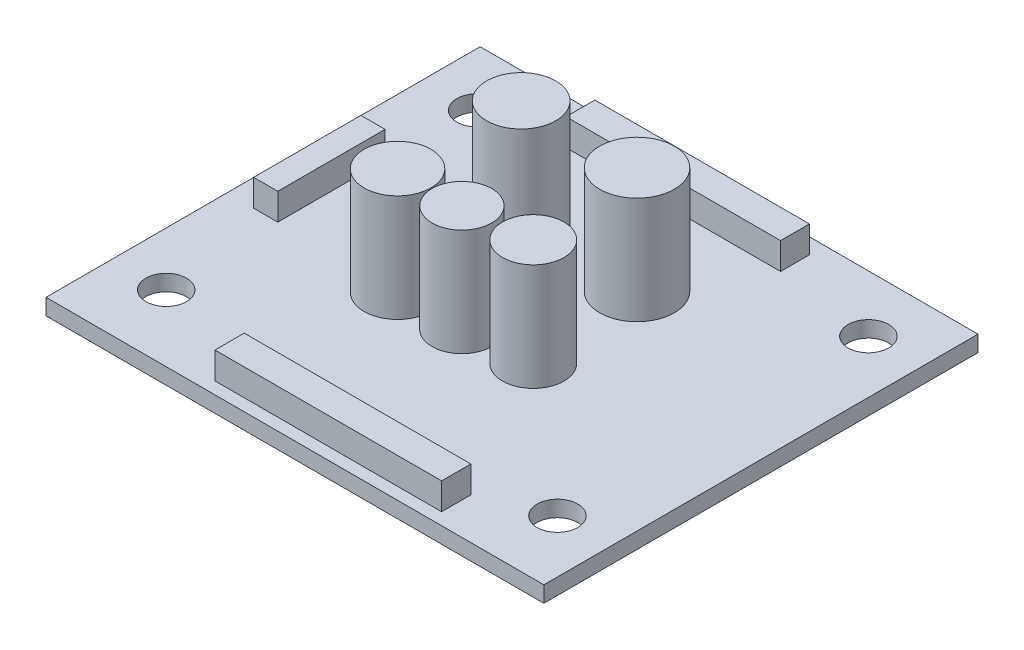
ISO-10303-21;
HEADER;
FILE_DESCRIPTION(('STEP AP214'),'2;1');
FILE_NAME('part.step','',(''),(''),'','','');
FILE_SCHEMA(('AUTOMOTIVE_DESIGN { 1 0 10303 214 1 1 1 1 }'));
ENDSEC;
DATA;
#1=APPLICATION_CONTEXT('core data for automotive mechanical design processes');
#2=APPLICATION_PROTOCOL_DEFINITION('international standard','automotive_design',2000,#1);
#3=PRODUCT_CONTEXT('',#1,'mechanical');
#4=PRODUCT('Part','Part','',(#3));
#5=PRODUCT_RELATED_PRODUCT_CATEGORY('part','',(#4));
#6=PRODUCT_DEFINITION_FORMATION('','',#4);
#7=PRODUCT_DEFINITION_CONTEXT('part definition',#1,'design');
#8=PRODUCT_DEFINITION('design','',#6,#7);
#9=PRODUCT_DEFINITION_SHAPE('','',#8);
#10=(LENGTH_UNIT() NAMED_UNIT(*) SI_UNIT(.MILLI.,.METRE.));
#11=(NAMED_UNIT(*) PLANE_ANGLE_UNIT() SI_UNIT($,.RADIAN.));
#12=(NAMED_UNIT(*) SI_UNIT($,.STERADIAN.) SOLID_ANGLE_UNIT());
#13=UNCERTAINTY_MEASURE_WITH_UNIT(LENGTH_MEASURE(1.E-05),#10,'distance_accuracy_value','');
#14=(GEOMETRIC_REPRESENTATION_CONTEXT(3) GLOBAL_UNCERTAINTY_ASSIGNED_CONTEXT((#13)) GLOBAL_UNIT_ASSIGNED_CONTEXT((#10,
#11,#12)) REPRESENTATION_CONTEXT('',''));
#15=CARTESIAN_POINT('',(0.,0.,0.));
#16=DIRECTION('',(0.,0.,1.));
#17=DIRECTION('',(1.,0.,0.));
#18=AXIS2_PLACEMENT_3D('',#15,#16,#17);
#19=CARTESIAN_POINT('',(0.,1.2,0.));
#20=DIRECTION('',(0.,1.,0.));
#21=DIRECTION('',(0.,0.,1.));
#22=AXIS2_PLACEMENT_3D('',#19,#20,#21);
#23=PLANE('',#22);
#24=CARTESIAN_POINT('',(13.6045077184445,1.2,-8.49375733152258));
#25=DIRECTION('',(0.,1.,0.));
#26=DIRECTION('',(0.,0.,1.));
#27=AXIS2_PLACEMENT_3D('',#24,#25,#26);
#28=CIRCLE('',#27,2.22948929078306);
#29=CARTESIAN_POINT('',(13.6045077184445,1.2,-6.26426804073952));
#30=VERTEX_POINT('',#29);
#31=EDGE_CURVE('E232',#30,#30,#28,.T.);
#32=ORIENTED_EDGE('',*,*,#31,.F.);
#33=EDGE_LOOP('',(#32));
#34=FACE_BOUND('',#33,.T.);
#35=CARTESIAN_POINT('',(18.472433281627,1.2,-8.96014540943228));
#36=DIRECTION('',(0.,1.,0.));
#37=DIRECTION('',(0.,0.,1.));
#38=AXIS2_PLACEMENT_3D('',#35,#36,#37);
#39=CIRCLE('',#38,2.29743472534764);
#40=CARTESIAN_POINT('',(18.472433281627,1.2,-6.66271068408464));
#41=VERTEX_POINT('',#40);
#42=EDGE_CURVE('E236',#41,#41,#39,.T.);
#43=ORIENTED_EDGE('',*,*,#42,.F.);
#44=EDGE_LOOP('',(#43));
#45=FACE_BOUND('',#44,.T.);
#46=CARTESIAN_POINT('',(8.79488066500068,1.2,-8.49375733152258));
#47=DIRECTION('',(0.,1.,0.));
#48=DIRECTION('',(0.,0.,1.));
#49=AXIS2_PLACEMENT_3D('',#46,#47,#48);
#50=CIRCLE('',#49,2.5);
#51=CARTESIAN_POINT('',(8.79488066500068,1.2,-5.99375733152258));
#52=VERTEX_POINT('',#51);
#53=EDGE_CURVE('E242',#52,#52,#50,.T.);
#54=ORIENTED_EDGE('',*,*,#53,.F.);
#55=EDGE_LOOP('',(#54));
#56=FACE_BOUND('',#55,.T.);
#57=CARTESIAN_POINT('',(17.6854034001544,1.2,-17.5008770861537));
#58=DIRECTION('',(0.,1.,0.));
#59=DIRECTION('',(0.,0.,1.));
#60=AXIS2_PLACEMENT_3D('',#57,#58,#59);
#61=CIRCLE('',#60,2.79011819509091);
#62=CARTESIAN_POINT('',(17.6854034001544,1.2,-14.7107588910628));
#63=VERTEX_POINT('',#62);
#64=EDGE_CURVE('E248',#63,#63,#61,.T.);
#65=ORIENTED_EDGE('',*,*,#64,.F.);
#66=EDGE_LOOP('',(#65));
#67=FACE_BOUND('',#66,.T.);
#68=CARTESIAN_POINT('',(9.02807470395553,1.2,-17.5008770861537));
#69=DIRECTION('',(0.,1.,0.));
#70=DIRECTION('',(0.,0.,1.));
#71=AXIS2_PLACEMENT_3D('',#68,#69,#70);
#72=CIRCLE('',#71,2.58312401052913);
#73=CARTESIAN_POINT('',(9.02807470395553,1.2,-14.9177530756246));
#74=VERTEX_POINT('',#73);
#75=EDGE_CURVE('E254',#74,#74,#72,.T.);
#76=ORIENTED_EDGE('',*,*,#75,.F.);
#77=EDGE_LOOP('',(#76));
#78=FACE_BOUND('',#77,.T.);
#79=CARTESIAN_POINT('',(29.2399999999999,1.2,-23.24));
#80=DIRECTION('',(0.,1.,0.));
#81=DIRECTION('',(0.,0.,1.));
#82=AXIS2_PLACEMENT_3D('',#79,#80,#81);
#83=CIRCLE('',#82,1.52);
#84=CARTESIAN_POINT('',(29.2399999999999,1.2,-21.72));
#85=VERTEX_POINT('',#84);
#86=EDGE_CURVE('E269',#85,#85,#83,.T.);
#87=ORIENTED_EDGE('',*,*,#86,.F.);
#88=EDGE_LOOP('',(#87));
#89=FACE_BOUND('',#88,.T.);
#90=CARTESIAN_POINT('',(0.,1.2,0.));
#91=DIRECTION('',(0.,1.,0.));
#92=DIRECTION('',(0.,0.,1.));
#93=AXIS2_PLACEMENT_3D('',#90,#91,#92);
#94=CIRCLE('',#93,1.52);
#95=CARTESIAN_POINT('',(0.,1.2,1.52));
#96=VERTEX_POINT('',#95);
#97=EDGE_CURVE('E281',#96,#96,#94,.T.);
#98=ORIENTED_EDGE('',*,*,#97,.F.);
#99=EDGE_LOOP('',(#98));
#100=FACE_BOUND('',#99,.T.);
#101=DIRECTION('',(0.,0.,1.));
#102=VECTOR('',#101,1.);
#103=CARTESIAN_POINT('',(-4.00853730179929,1.2,-27.4702467646625));
#104=LINE('',#103,#102);
#105=CARTESIAN_POINT('',(-4.00853730179929,1.2,-27.4702467646625));
#106=VERTEX_POINT('',#105);
#107=CARTESIAN_POINT('',(-4.00853730179929,1.2,4.97352293130904));
#108=VERTEX_POINT('',#107);
#109=EDGE_CURVE('E287',#106,#108,#104,.T.);
#110=ORIENTED_EDGE('',*,*,#109,.T.);
#111=DIRECTION('',(1.,0.,0.));
#112=VECTOR('',#111,1.);
#113=CARTESIAN_POINT('',(-4.00853730179929,1.2,4.97352293130904));
#114=LINE('',#113,#112);
#115=CARTESIAN_POINT('',(33.1997020698045,1.2,4.97352293130904));
#116=VERTEX_POINT('',#115);
#117=EDGE_CURVE('E290',#108,#116,#114,.T.);
#118=ORIENTED_EDGE('',*,*,#117,.T.);
#119=DIRECTION('',(0.,0.,-1.));
#120=VECTOR('',#119,1.);
#121=CARTESIAN_POINT('',(33.1997020698045,1.2,-27.4702467646625));
#122=LINE('',#121,#120);
#123=CARTESIAN_POINT('',(33.1997020698045,1.2,-27.4702467646625));
#124=VERTEX_POINT('',#123);
#125=EDGE_CURVE('E293',#116,#124,#122,.T.);
#126=ORIENTED_EDGE('',*,*,#125,.T.);
#127=DIRECTION('',(-1.,0.,0.));
#128=VECTOR('',#127,1.);
#129=CARTESIAN_POINT('',(-4.00853730179929,1.2,-27.4702467646625));
#130=LINE('',#129,#128);
#131=EDGE_CURVE('E295',#124,#106,#130,.T.);
#132=ORIENTED_EDGE('',*,*,#131,.T.);
#133=EDGE_LOOP('',(#110,#118,#126,#132));
#134=FACE_BOUND('',#133,.T.);
#135=CARTESIAN_POINT('',(29.24,1.2,0.));
#136=DIRECTION('',(0.,1.,0.));
#137=DIRECTION('',(0.,0.,1.));
#138=AXIS2_PLACEMENT_3D('',#135,#136,#137);
#139=CIRCLE('',#138,1.52);
#140=CARTESIAN_POINT('',(29.24,1.2,1.52));
#141=VERTEX_POINT('',#140);
#142=EDGE_CURVE('E275',#141,#141,#139,.T.);
#143=ORIENTED_EDGE('',*,*,#142,.F.);
#144=EDGE_LOOP('',(#143));
#145=FACE_BOUND('',#144,.T.);
#146=CARTESIAN_POINT('',(0.,1.2,-23.24));
#147=DIRECTION('',(0.,1.,0.));
#148=DIRECTION('',(0.,0.,1.));
#149=AXIS2_PLACEMENT_3D('',#146,#147,#148);
#150=CIRCLE('',#149,1.52);
#151=CARTESIAN_POINT('',(0.,1.2,-21.72));
#152=VERTEX_POINT('',#151);
#153=EDGE_CURVE('E263',#152,#152,#150,.T.);
#154=ORIENTED_EDGE('',*,*,#153,.F.);
#155=EDGE_LOOP('',(#154));
#156=FACE_BOUND('',#155,.T.);
#157=DIRECTION('',(1.,0.,0.));
#158=VECTOR('',#157,1.);
#159=CARTESIAN_POINT('',(7.71635823483449,1.2,4.06957151717004));
#160=LINE('',#159,#158);
#161=CARTESIAN_POINT('',(7.71635823483449,1.2,4.06957151717004));
#162=VERTEX_POINT('',#161);
#163=CARTESIAN_POINT('',(24.6520753139305,1.2,4.06957151717004));
#164=VERTEX_POINT('',#163);
#165=EDGE_CURVE('E217',#162,#164,#160,.T.);
#166=ORIENTED_EDGE('',*,*,#165,.F.);
#167=DIRECTION('',(0.,0.,1.));
#168=VECTOR('',#167,1.);
#169=CARTESIAN_POINT('',(7.71635823483449,1.2,1.88337740196831));
#170=LINE('',#169,#168);
#171=CARTESIAN_POINT('',(7.71635823483449,1.2,1.88337740196831));
#172=VERTEX_POINT('',#171);
#173=EDGE_CURVE('E203',#172,#162,#170,.T.);
#174=ORIENTED_EDGE('',*,*,#173,.F.);
#175=DIRECTION('',(-1.,0.,0.));
#176=VECTOR('',#175,1.);
#177=CARTESIAN_POINT('',(7.71635823483449,1.2,1.88337740196831));
#178=LINE('',#177,#176);
#179=CARTESIAN_POINT('',(24.6520753139305,1.2,1.88337740196831));
#180=VERTEX_POINT('',#179);
#181=EDGE_CURVE('E208',#180,#172,#178,.T.);
#182=ORIENTED_EDGE('',*,*,#181,.F.);
#183=DIRECTION('',(0.,0.,-1.));
#184=VECTOR('',#183,1.);
#185=CARTESIAN_POINT('',(24.6520753139305,1.2,1.88337740196831));
#186=LINE('',#185,#184);
#187=EDGE_CURVE('E219',#164,#180,#186,.T.);
#188=ORIENTED_EDGE('',*,*,#187,.F.);
#189=EDGE_LOOP('',(#166,#174,#182,#188));
#190=FACE_BOUND('',#189,.T.);
#191=DIRECTION('',(1.,0.,0.));
#192=VECTOR('',#191,1.);
#193=CARTESIAN_POINT('',(5.73420890371826,1.2,-24.1469071963669));
#194=LINE('',#193,#192);
#195=CARTESIAN_POINT('',(5.73420890371826,1.2,-24.1469071963669));
#196=VERTEX_POINT('',#195);
#197=CARTESIAN_POINT('',(21.7662990818643,1.2,-24.1469071963669));
#198=VERTEX_POINT('',#197);
#199=EDGE_CURVE('E175',#196,#198,#194,.T.);
#200=ORIENTED_EDGE('',*,*,#199,.F.);
#201=DIRECTION('',(0.,0.,1.));
#202=VECTOR('',#201,1.);
#203=CARTESIAN_POINT('',(5.73420890371826,1.2,-26.3039520566993));
#204=LINE('',#203,#202);
#205=CARTESIAN_POINT('',(5.73420890371826,1.2,-26.3039520566993));
#206=VERTEX_POINT('',#205);
#207=EDGE_CURVE('E172',#206,#196,#204,.T.);
#208=ORIENTED_EDGE('',*,*,#207,.F.);
#209=DIRECTION('',(-1.,0.,0.));
#210=VECTOR('',#209,1.);
#211=CARTESIAN_POINT('',(5.73420890371826,1.2,-26.3039520566993));
#212=LINE('',#211,#210);
#213=CARTESIAN_POINT('',(21.7662990818643,1.2,-26.3039520566993));
#214=VERTEX_POINT('',#213);
#215=EDGE_CURVE('E184',#214,#206,#212,.T.);
#216=ORIENTED_EDGE('',*,*,#215,.F.);
#217=DIRECTION('',(0.,0.,-1.));
#218=VECTOR('',#217,1.);
#219=CARTESIAN_POINT('',(21.7662990818643,1.2,-26.3039520566993));
#220=LINE('',#219,#218);
#221=EDGE_CURVE('E192',#198,#214,#220,.T.);
#222=ORIENTED_EDGE('',*,*,#221,.F.);
#223=EDGE_LOOP('',(#200,#208,#216,#222));
#224=FACE_BOUND('',#223,.T.);
#225=DIRECTION('',(1.,0.,0.));
#226=VECTOR('',#225,1.);
#227=CARTESIAN_POINT('',(-2.01949289153053,1.2,-8.55205584126127));
#228=LINE('',#227,#226);
#229=CARTESIAN_POINT('',(-2.01949289153053,1.2,-8.55205584126127));
#230=VERTEX_POINT('',#229);
#231=CARTESIAN_POINT('',(-0.212239089630438,1.2,-8.55205584126127));
#232=VERTEX_POINT('',#231);
#233=EDGE_CURVE('E680',#230,#232,#228,.T.);
#234=ORIENTED_EDGE('',*,*,#233,.F.);
#235=DIRECTION('',(0.,0.,1.));
#236=VECTOR('',#235,1.);
#237=CARTESIAN_POINT('',(-2.01949289153053,1.2,-16.5681009303343));
#238=LINE('',#237,#236);
#239=CARTESIAN_POINT('',(-2.01949289153053,1.2,-16.5681009303343));
#240=VERTEX_POINT('',#239);
#241=EDGE_CURVE('E170',#240,#230,#238,.T.);
#242=ORIENTED_EDGE('',*,*,#241,.F.);
#243=DIRECTION('',(-1.,0.,0.));
#244=VECTOR('',#243,1.);
#245=CARTESIAN_POINT('',(-2.01949289153053,1.2,-16.5681009303343));
#246=LINE('',#245,#244);
#247=CARTESIAN_POINT('',(-0.212239089630438,1.2,-16.5681009303343));
#248=VERTEX_POINT('',#247);
#249=EDGE_CURVE('E166',#248,#240,#246,.T.);
#250=ORIENTED_EDGE('',*,*,#249,.F.);
#251=DIRECTION('',(0.,0.,-1.));
#252=VECTOR('',#251,1.);
#253=CARTESIAN_POINT('',(-0.212239089630438,1.2,-16.5681009303343));
#254=LINE('',#253,#252);
#255=EDGE_CURVE('E677',#232,#248,#254,.T.);
#256=ORIENTED_EDGE('',*,*,#255,.F.);
#257=EDGE_LOOP('',(#234,#242,#250,#256));
#258=FACE_BOUND('',#257,.T.);
#259=ADVANCED_FACE('F33',(#34,#45,#56,#67,#78,#89,#100,#134,#145,#156,#190,#224,#258),#23,.T.);
#260=CARTESIAN_POINT('',(0.,0.,0.));
#261=DIRECTION('',(0.,1.,0.));
#262=DIRECTION('',(0.,0.,1.));
#263=AXIS2_PLACEMENT_3D('',#260,#261,#262);
#264=PLANE('',#263);
#265=DIRECTION('',(0.,0.,1.));
#266=VECTOR('',#265,1.);
#267=CARTESIAN_POINT('',(-4.00853730179929,0.,-27.4702467646625));
#268=LINE('',#267,#266);
#269=CARTESIAN_POINT('',(-4.00853730179929,0.,-27.4702467646625));
#270=VERTEX_POINT('',#269);
#271=CARTESIAN_POINT('',(-4.00853730179929,0.,4.97352293130904));
#272=VERTEX_POINT('',#271);
#273=EDGE_CURVE('E284',#270,#272,#268,.T.);
#274=ORIENTED_EDGE('',*,*,#273,.F.);
#275=DIRECTION('',(-1.,0.,0.));
#276=VECTOR('',#275,1.);
#277=CARTESIAN_POINT('',(-4.00853730179929,0.,-27.4702467646625));
#278=LINE('',#277,#276);
#279=CARTESIAN_POINT('',(33.1997020698045,0.,-27.4702467646625));
#280=VERTEX_POINT('',#279);
#281=EDGE_CURVE('E291',#280,#270,#278,.T.);
#282=ORIENTED_EDGE('',*,*,#281,.F.);
#283=DIRECTION('',(0.,0.,-1.));
#284=VECTOR('',#283,1.);
#285=CARTESIAN_POINT('',(33.1997020698045,0.,-27.4702467646625));
#286=LINE('',#285,#284);
#287=CARTESIAN_POINT('',(33.1997020698045,0.,4.97352293130904));
#288=VERTEX_POINT('',#287);
#289=EDGE_CURVE('E302',#288,#280,#286,.T.);
#290=ORIENTED_EDGE('',*,*,#289,.F.);
#291=DIRECTION('',(1.,0.,0.));
#292=VECTOR('',#291,1.);
#293=CARTESIAN_POINT('',(-4.00853730179929,0.,4.97352293130904));
#294=LINE('',#293,#292);
#295=EDGE_CURVE('E300',#272,#288,#294,.T.);
#296=ORIENTED_EDGE('',*,*,#295,.F.);
#297=EDGE_LOOP('',(#274,#282,#290,#296));
#298=FACE_BOUND('',#297,.T.);
#299=CARTESIAN_POINT('',(0.,0.,0.));
#300=DIRECTION('',(0.,1.,0.));
#301=DIRECTION('',(0.,0.,1.));
#302=AXIS2_PLACEMENT_3D('',#299,#300,#301);
#303=CIRCLE('',#302,1.52);
#304=CARTESIAN_POINT('',(0.,0.,1.52));
#305=VERTEX_POINT('',#304);
#306=EDGE_CURVE('E278',#305,#305,#303,.T.);
#307=ORIENTED_EDGE('',*,*,#306,.T.);
#308=EDGE_LOOP('',(#307));
#309=FACE_BOUND('',#308,.T.);
#310=CARTESIAN_POINT('',(29.24,0.,0.));
#311=DIRECTION('',(0.,1.,0.));
#312=DIRECTION('',(0.,0.,1.));
#313=AXIS2_PLACEMENT_3D('',#310,#311,#312);
#314=CIRCLE('',#313,1.52);
#315=CARTESIAN_POINT('',(29.24,0.,1.52));
#316=VERTEX_POINT('',#315);
#317=EDGE_CURVE('E272',#316,#316,#314,.T.);
#318=ORIENTED_EDGE('',*,*,#317,.T.);
#319=EDGE_LOOP('',(#318));
#320=FACE_BOUND('',#319,.T.);
#321=CARTESIAN_POINT('',(29.2399999999999,0.,-23.24));
#322=DIRECTION('',(0.,1.,0.));
#323=DIRECTION('',(0.,0.,1.));
#324=AXIS2_PLACEMENT_3D('',#321,#322,#323);
#325=CIRCLE('',#324,1.52);
#326=CARTESIAN_POINT('',(29.2399999999999,0.,-21.72));
#327=VERTEX_POINT('',#326);
#328=EDGE_CURVE('E266',#327,#327,#325,.T.);
#329=ORIENTED_EDGE('',*,*,#328,.T.);
#330=EDGE_LOOP('',(#329));
#331=FACE_BOUND('',#330,.T.);
#332=CARTESIAN_POINT('',(0.,0.,-23.24));
#333=DIRECTION('',(0.,1.,0.));
#334=DIRECTION('',(0.,0.,1.));
#335=AXIS2_PLACEMENT_3D('',#332,#333,#334);
#336=CIRCLE('',#335,1.52);
#337=CARTESIAN_POINT('',(0.,0.,-21.72));
#338=VERTEX_POINT('',#337);
#339=EDGE_CURVE('E260',#338,#338,#336,.T.);
#340=ORIENTED_EDGE('',*,*,#339,.T.);
#341=EDGE_LOOP('',(#340));
#342=FACE_BOUND('',#341,.T.);
#343=ADVANCED_FACE('F320',(#298,#309,#320,#331,#342),#264,.F.);
#344=CARTESIAN_POINT('',(-4.00853730179929,1.2,-27.4702467646625));
#345=DIRECTION('',(1.,0.,0.));
#346=DIRECTION('',(0.,0.,-1.));
#347=AXIS2_PLACEMENT_3D('',#344,#345,#346);
#348=PLANE('',#347);
#349=ORIENTED_EDGE('',*,*,#273,.T.);
#350=DIRECTION('',(0.,-1.,0.));
#351=VECTOR('',#350,1.);
#352=CARTESIAN_POINT('',(-4.00853730179929,1.2,4.97352293130904));
#353=LINE('',#352,#351);
#354=EDGE_CURVE('E11',#108,#272,#353,.T.);
#355=ORIENTED_EDGE('',*,*,#354,.F.);
#356=ORIENTED_EDGE('',*,*,#109,.F.);
#357=DIRECTION('',(0.,-1.,0.));
#358=VECTOR('',#357,1.);
#359=CARTESIAN_POINT('',(-4.00853730179929,1.2,-27.4702467646625));
#360=LINE('',#359,#358);
#361=EDGE_CURVE('E297',#106,#270,#360,.T.);
#362=ORIENTED_EDGE('',*,*,#361,.T.);
#363=EDGE_LOOP('',(#349,#355,#356,#362));
#364=FACE_BOUND('',#363,.T.);
#365=ADVANCED_FACE('F35',(#364),#348,.F.);
#366=CARTESIAN_POINT('',(-4.00853730179929,1.2,4.97352293130904));
#367=DIRECTION('',(0.,0.,-1.));
#368=DIRECTION('',(-1.,0.,0.));
#369=AXIS2_PLACEMENT_3D('',#366,#367,#368);
#370=PLANE('',#369);
#371=ORIENTED_EDGE('',*,*,#295,.T.);
#372=DIRECTION('',(0.,-1.,0.));
#373=VECTOR('',#372,1.);
#374=CARTESIAN_POINT('',(33.1997020698045,1.2,4.97352293130904));
#375=LINE('',#374,#373);
#376=EDGE_CURVE('E41',#116,#288,#375,.T.);
#377=ORIENTED_EDGE('',*,*,#376,.F.);
#378=ORIENTED_EDGE('',*,*,#117,.F.);
#379=ORIENTED_EDGE('',*,*,#354,.T.);
#380=EDGE_LOOP('',(#371,#377,#378,#379));
#381=FACE_BOUND('',#380,.T.);
#382=ADVANCED_FACE('F331',(#381),#370,.F.);
#383=CARTESIAN_POINT('',(33.1997020698045,1.2,-27.4702467646625));
#384=DIRECTION('',(-1.,0.,0.));
#385=DIRECTION('',(0.,0.,1.));
#386=AXIS2_PLACEMENT_3D('',#383,#384,#385);
#387=PLANE('',#386);
#388=ORIENTED_EDGE('',*,*,#289,.T.);
#389=DIRECTION('',(0.,-1.,0.));
#390=VECTOR('',#389,1.);
#391=CARTESIAN_POINT('',(33.1997020698045,1.2,-27.4702467646625));
#392=LINE('',#391,#390);
#393=EDGE_CURVE('E307',#124,#280,#392,.T.);
#394=ORIENTED_EDGE('',*,*,#393,.F.);
#395=ORIENTED_EDGE('',*,*,#125,.F.);
#396=ORIENTED_EDGE('',*,*,#376,.T.);
#397=EDGE_LOOP('',(#388,#394,#395,#396));
#398=FACE_BOUND('',#397,.T.);
#399=ADVANCED_FACE('F314',(#398),#387,.F.);
#400=CARTESIAN_POINT('',(-4.00853730179929,1.2,-27.4702467646625));
#401=DIRECTION('',(0.,0.,1.));
#402=DIRECTION('',(1.,0.,0.));
#403=AXIS2_PLACEMENT_3D('',#400,#401,#402);
#404=PLANE('',#403);
#405=ORIENTED_EDGE('',*,*,#281,.T.);
#406=ORIENTED_EDGE('',*,*,#361,.F.);
#407=ORIENTED_EDGE('',*,*,#131,.F.);
#408=ORIENTED_EDGE('',*,*,#393,.T.);
#409=EDGE_LOOP('',(#405,#406,#407,#408));
#410=FACE_BOUND('',#409,.T.);
#411=ADVANCED_FACE('F324',(#410),#404,.F.);
#412=CARTESIAN_POINT('',(0.,1.2,0.));
#413=DIRECTION('',(0.,-1.,0.));
#414=DIRECTION('',(0.,0.,-1.));
#415=AXIS2_PLACEMENT_3D('',#412,#413,#414);
#416=CYLINDRICAL_SURFACE('',#415,1.52);
#417=ORIENTED_EDGE('',*,*,#97,.T.);
#418=EDGE_LOOP('',(#417));
#419=FACE_BOUND('',#418,.T.);
#420=ORIENTED_EDGE('',*,*,#306,.F.);
#421=EDGE_LOOP('',(#420));
#422=FACE_BOUND('',#421,.T.);
#423=ADVANCED_FACE('F348',(#419,#422),#416,.F.);
#424=CARTESIAN_POINT('',(29.24,1.2,0.));
#425=DIRECTION('',(0.,-1.,0.));
#426=DIRECTION('',(0.,0.,-1.));
#427=AXIS2_PLACEMENT_3D('',#424,#425,#426);
#428=CYLINDRICAL_SURFACE('',#427,1.52);
#429=ORIENTED_EDGE('',*,*,#142,.T.);
#430=EDGE_LOOP('',(#429));
#431=FACE_BOUND('',#430,.T.);
#432=ORIENTED_EDGE('',*,*,#317,.F.);
#433=EDGE_LOOP('',(#432));
#434=FACE_BOUND('',#433,.T.);
#435=ADVANCED_FACE('F355',(#431,#434),#428,.F.);
#436=CARTESIAN_POINT('',(29.2399999999999,1.2,-23.24));
#437=DIRECTION('',(0.,-1.,0.));
#438=DIRECTION('',(0.,0.,-1.));
#439=AXIS2_PLACEMENT_3D('',#436,#437,#438);
#440=CYLINDRICAL_SURFACE('',#439,1.52);
#441=ORIENTED_EDGE('',*,*,#86,.T.);
#442=EDGE_LOOP('',(#441));
#443=FACE_BOUND('',#442,.T.);
#444=ORIENTED_EDGE('',*,*,#328,.F.);
#445=EDGE_LOOP('',(#444));
#446=FACE_BOUND('',#445,.T.);
#447=ADVANCED_FACE('F360',(#443,#446),#440,.F.);
#448=CARTESIAN_POINT('',(0.,1.2,-23.24));
#449=DIRECTION('',(0.,-1.,0.));
#450=DIRECTION('',(0.,0.,-1.));
#451=AXIS2_PLACEMENT_3D('',#448,#449,#450);
#452=CYLINDRICAL_SURFACE('',#451,1.52);
#453=ORIENTED_EDGE('',*,*,#153,.T.);
#454=EDGE_LOOP('',(#453));
#455=FACE_BOUND('',#454,.T.);
#456=ORIENTED_EDGE('',*,*,#339,.F.);
#457=EDGE_LOOP('',(#456));
#458=FACE_BOUND('',#457,.T.);
#459=ADVANCED_FACE('F372',(#455,#458),#452,.F.);
#460=CARTESIAN_POINT('',(9.02807470395553,9.2,-17.5008770861537));
#461=DIRECTION('',(0.,-1.,0.));
#462=DIRECTION('',(0.,0.,-1.));
#463=AXIS2_PLACEMENT_3D('',#460,#461,#462);
#464=CYLINDRICAL_SURFACE('',#463,2.58312401052913);
#465=CARTESIAN_POINT('',(9.02807470395553,9.2,-17.5008770861537));
#466=DIRECTION('',(0.,1.,0.));
#467=DIRECTION('',(0.,0.,1.));
#468=AXIS2_PLACEMENT_3D('',#465,#466,#467);
#469=CIRCLE('',#468,2.58312401052913);
#470=CARTESIAN_POINT('',(9.02807470395553,9.2,-14.9177530756246));
#471=VERTEX_POINT('',#470);
#472=EDGE_CURVE('E257',#471,#471,#469,.T.);
#473=ORIENTED_EDGE('',*,*,#472,.F.);
#474=EDGE_LOOP('',(#473));
#475=FACE_BOUND('',#474,.T.);
#476=ORIENTED_EDGE('',*,*,#75,.T.);
#477=EDGE_LOOP('',(#476));
#478=FACE_BOUND('',#477,.T.);
#479=ADVANCED_FACE('F374',(#475,#478),#464,.T.);
#480=CARTESIAN_POINT('',(9.02807470395553,9.2,-17.5008770861537));
#481=DIRECTION('',(0.,1.,0.));
#482=DIRECTION('',(0.,0.,1.));
#483=AXIS2_PLACEMENT_3D('',#480,#481,#482);
#484=PLANE('',#483);
#485=ORIENTED_EDGE('',*,*,#472,.T.);
#486=EDGE_LOOP('',(#485));
#487=FACE_BOUND('',#486,.T.);
#488=ADVANCED_FACE('F381',(#487),#484,.T.);
#489=CARTESIAN_POINT('',(17.6854034001544,9.2,-17.5008770861537));
#490=DIRECTION('',(0.,-1.,0.));
#491=DIRECTION('',(0.,0.,-1.));
#492=AXIS2_PLACEMENT_3D('',#489,#490,#491);
#493=CYLINDRICAL_SURFACE('',#492,2.79011819509091);
#494=CARTESIAN_POINT('',(17.6854034001544,9.2,-17.5008770861537));
#495=DIRECTION('',(0.,1.,0.));
#496=DIRECTION('',(0.,0.,1.));
#497=AXIS2_PLACEMENT_3D('',#494,#495,#496);
#498=CIRCLE('',#497,2.79011819509091);
#499=CARTESIAN_POINT('',(17.6854034001544,9.2,-14.7107588910628));
#500=VERTEX_POINT('',#499);
#501=EDGE_CURVE('E251',#500,#500,#498,.T.);
#502=ORIENTED_EDGE('',*,*,#501,.F.);
#503=EDGE_LOOP('',(#502));
#504=FACE_BOUND('',#503,.T.);
#505=ORIENTED_EDGE('',*,*,#64,.T.);
#506=EDGE_LOOP('',(#505));
#507=FACE_BOUND('',#506,.T.);
#508=ADVANCED_FACE('F389',(#504,#507),#493,.T.);
#509=CARTESIAN_POINT('',(17.6854034001544,9.2,-17.5008770861537));
#510=DIRECTION('',(0.,1.,0.));
#511=DIRECTION('',(0.,0.,1.));
#512=AXIS2_PLACEMENT_3D('',#509,#510,#511);
#513=PLANE('',#512);
#514=ORIENTED_EDGE('',*,*,#501,.T.);
#515=EDGE_LOOP('',(#514));
#516=FACE_BOUND('',#515,.T.);
#517=ADVANCED_FACE('F393',(#516),#513,.T.);
#518=CARTESIAN_POINT('',(8.79488066500068,9.2,-8.49375733152258));
#519=DIRECTION('',(0.,-1.,0.));
#520=DIRECTION('',(0.,0.,-1.));
#521=AXIS2_PLACEMENT_3D('',#518,#519,#520);
#522=CYLINDRICAL_SURFACE('',#521,2.5);
#523=CARTESIAN_POINT('',(8.79488066500068,9.2,-8.49375733152258));
#524=DIRECTION('',(0.,1.,0.));
#525=DIRECTION('',(0.,0.,1.));
#526=AXIS2_PLACEMENT_3D('',#523,#524,#525);
#527=CIRCLE('',#526,2.5);
#528=CARTESIAN_POINT('',(8.79488066500068,9.2,-5.99375733152258));
#529=VERTEX_POINT('',#528);
#530=EDGE_CURVE('E245',#529,#529,#527,.T.);
#531=ORIENTED_EDGE('',*,*,#530,.F.);
#532=EDGE_LOOP('',(#531));
#533=FACE_BOUND('',#532,.T.);
#534=ORIENTED_EDGE('',*,*,#53,.T.);
#535=EDGE_LOOP('',(#534));
#536=FACE_BOUND('',#535,.T.);
#537=ADVANCED_FACE('F397',(#533,#536),#522,.T.);
#538=CARTESIAN_POINT('',(8.79488066500068,9.2,-8.49375733152258));
#539=DIRECTION('',(0.,1.,0.));
#540=DIRECTION('',(0.,0.,1.));
#541=AXIS2_PLACEMENT_3D('',#538,#539,#540);
#542=PLANE('',#541);
#543=ORIENTED_EDGE('',*,*,#530,.T.);
#544=EDGE_LOOP('',(#543));
#545=FACE_BOUND('',#544,.T.);
#546=ADVANCED_FACE('F401',(#545),#542,.T.);
#547=CARTESIAN_POINT('',(18.472433281627,9.2,-8.96014540943228));
#548=DIRECTION('',(0.,-1.,0.));
#549=DIRECTION('',(0.,0.,-1.));
#550=AXIS2_PLACEMENT_3D('',#547,#548,#549);
#551=CYLINDRICAL_SURFACE('',#550,2.29743472534764);
#552=CARTESIAN_POINT('',(18.472433281627,9.2,-8.96014540943228));
#553=DIRECTION('',(0.,1.,0.));
#554=DIRECTION('',(0.,0.,1.));
#555=AXIS2_PLACEMENT_3D('',#552,#553,#554);
#556=CIRCLE('',#555,2.29743472534764);
#557=CARTESIAN_POINT('',(18.472433281627,9.2,-6.66271068408464));
#558=VERTEX_POINT('',#557);
#559=EDGE_CURVE('E239',#558,#558,#556,.T.);
#560=ORIENTED_EDGE('',*,*,#559,.F.);
#561=EDGE_LOOP('',(#560));
#562=FACE_BOUND('',#561,.T.);
#563=ORIENTED_EDGE('',*,*,#42,.T.);
#564=EDGE_LOOP('',(#563));
#565=FACE_BOUND('',#564,.T.);
#566=ADVANCED_FACE('F405',(#562,#565),#551,.T.);
#567=CARTESIAN_POINT('',(18.472433281627,9.2,-8.96014540943228));
#568=DIRECTION('',(0.,1.,0.));
#569=DIRECTION('',(0.,0.,1.));
#570=AXIS2_PLACEMENT_3D('',#567,#568,#569);
#571=PLANE('',#570);
#572=ORIENTED_EDGE('',*,*,#559,.T.);
#573=EDGE_LOOP('',(#572));
#574=FACE_BOUND('',#573,.T.);
#575=ADVANCED_FACE('F409',(#574),#571,.T.);
#576=CARTESIAN_POINT('',(13.6045077184445,9.2,-8.49375733152258));
#577=DIRECTION('',(0.,-1.,0.));
#578=DIRECTION('',(0.,0.,-1.));
#579=AXIS2_PLACEMENT_3D('',#576,#577,#578);
#580=CYLINDRICAL_SURFACE('',#579,2.22948929078306);
#581=CARTESIAN_POINT('',(13.6045077184445,9.2,-8.49375733152258));
#582=DIRECTION('',(0.,1.,0.));
#583=DIRECTION('',(0.,0.,1.));
#584=AXIS2_PLACEMENT_3D('',#581,#582,#583);
#585=CIRCLE('',#584,2.22948929078306);
#586=CARTESIAN_POINT('',(13.6045077184445,9.2,-6.26426804073952));
#587=VERTEX_POINT('',#586);
#588=EDGE_CURVE('E233',#587,#587,#585,.T.);
#589=ORIENTED_EDGE('',*,*,#588,.F.);
#590=EDGE_LOOP('',(#589));
#591=FACE_BOUND('',#590,.T.);
#592=ORIENTED_EDGE('',*,*,#31,.T.);
#593=EDGE_LOOP('',(#592));
#594=FACE_BOUND('',#593,.T.);
#595=ADVANCED_FACE('F413',(#591,#594),#580,.T.);
#596=CARTESIAN_POINT('',(13.6045077184445,9.2,-8.49375733152258));
#597=DIRECTION('',(0.,1.,0.));
#598=DIRECTION('',(0.,0.,1.));
#599=AXIS2_PLACEMENT_3D('',#596,#597,#598);
#600=PLANE('',#599);
#601=ORIENTED_EDGE('',*,*,#588,.T.);
#602=EDGE_LOOP('',(#601));
#603=FACE_BOUND('',#602,.T.);
#604=ADVANCED_FACE('F417',(#603),#600,.T.);
#605=CARTESIAN_POINT('',(7.71635823483449,3.2,1.88337740196831));
#606=DIRECTION('',(1.,0.,0.));
#607=DIRECTION('',(0.,0.,-1.));
#608=AXIS2_PLACEMENT_3D('',#605,#606,#607);
#609=PLANE('',#608);
#610=ORIENTED_EDGE('',*,*,#173,.T.);
#611=DIRECTION('',(0.,-1.,0.));
#612=VECTOR('',#611,1.);
#613=CARTESIAN_POINT('',(7.71635823483449,3.2,4.06957151717004));
#614=LINE('',#613,#612);
#615=CARTESIAN_POINT('',(7.71635823483449,3.2,4.06957151717004));
#616=VERTEX_POINT('',#615);
#617=EDGE_CURVE('E230',#616,#162,#614,.T.);
#618=ORIENTED_EDGE('',*,*,#617,.F.);
#619=DIRECTION('',(0.,0.,1.));
#620=VECTOR('',#619,1.);
#621=CARTESIAN_POINT('',(7.71635823483449,3.2,1.88337740196831));
#622=LINE('',#621,#620);
#623=CARTESIAN_POINT('',(7.71635823483449,3.2,1.88337740196831));
#624=VERTEX_POINT('',#623);
#625=EDGE_CURVE('E204',#624,#616,#622,.T.);
#626=ORIENTED_EDGE('',*,*,#625,.F.);
#627=DIRECTION('',(0.,-1.,0.));
#628=VECTOR('',#627,1.);
#629=CARTESIAN_POINT('',(7.71635823483449,3.2,1.88337740196831));
#630=LINE('',#629,#628);
#631=EDGE_CURVE('E214',#624,#172,#630,.T.);
#632=ORIENTED_EDGE('',*,*,#631,.T.);
#633=EDGE_LOOP('',(#610,#618,#626,#632));
#634=FACE_BOUND('',#633,.T.);
#635=ADVANCED_FACE('F421',(#634),#609,.F.);
#636=CARTESIAN_POINT('',(7.71635823483449,3.2,4.06957151717004));
#637=DIRECTION('',(0.,0.,-1.));
#638=DIRECTION('',(-1.,0.,0.));
#639=AXIS2_PLACEMENT_3D('',#636,#637,#638);
#640=PLANE('',#639);
#641=ORIENTED_EDGE('',*,*,#165,.T.);
#642=DIRECTION('',(0.,-1.,0.));
#643=VECTOR('',#642,1.);
#644=CARTESIAN_POINT('',(24.6520753139305,3.2,4.06957151717004));
#645=LINE('',#644,#643);
#646=CARTESIAN_POINT('',(24.6520753139305,3.2,4.06957151717004));
#647=VERTEX_POINT('',#646);
#648=EDGE_CURVE('E227',#647,#164,#645,.T.);
#649=ORIENTED_EDGE('',*,*,#648,.F.);
#650=DIRECTION('',(1.,0.,0.));
#651=VECTOR('',#650,1.);
#652=CARTESIAN_POINT('',(7.71635823483449,3.2,4.06957151717004));
#653=LINE('',#652,#651);
#654=EDGE_CURVE('E207',#616,#647,#653,.T.);
#655=ORIENTED_EDGE('',*,*,#654,.F.);
#656=ORIENTED_EDGE('',*,*,#617,.T.);
#657=EDGE_LOOP('',(#641,#649,#655,#656));
#658=FACE_BOUND('',#657,.T.);
#659=ADVANCED_FACE('F425',(#658),#640,.F.);
#660=CARTESIAN_POINT('',(24.6520753139305,3.2,1.88337740196831));
#661=DIRECTION('',(-1.,0.,0.));
#662=DIRECTION('',(0.,0.,1.));
#663=AXIS2_PLACEMENT_3D('',#660,#661,#662);
#664=PLANE('',#663);
#665=ORIENTED_EDGE('',*,*,#187,.T.);
#666=DIRECTION('',(0.,-1.,0.));
#667=VECTOR('',#666,1.);
#668=CARTESIAN_POINT('',(24.6520753139305,3.2,1.88337740196831));
#669=LINE('',#668,#667);
#670=CARTESIAN_POINT('',(24.6520753139305,3.2,1.88337740196831));
#671=VERTEX_POINT('',#670);
#672=EDGE_CURVE('E225',#671,#180,#669,.T.);
#673=ORIENTED_EDGE('',*,*,#672,.F.);
#674=DIRECTION('',(0.,0.,-1.));
#675=VECTOR('',#674,1.);
#676=CARTESIAN_POINT('',(24.6520753139305,3.2,1.88337740196831));
#677=LINE('',#676,#675);
#678=EDGE_CURVE('E210',#647,#671,#677,.T.);
#679=ORIENTED_EDGE('',*,*,#678,.F.);
#680=ORIENTED_EDGE('',*,*,#648,.T.);
#681=EDGE_LOOP('',(#665,#673,#679,#680));
#682=FACE_BOUND('',#681,.T.);
#683=ADVANCED_FACE('F429',(#682),#664,.F.);
#684=CARTESIAN_POINT('',(7.71635823483449,3.2,1.88337740196831));
#685=DIRECTION('',(0.,0.,1.));
#686=DIRECTION('',(1.,0.,0.));
#687=AXIS2_PLACEMENT_3D('',#684,#685,#686);
#688=PLANE('',#687);
#689=ORIENTED_EDGE('',*,*,#181,.T.);
#690=ORIENTED_EDGE('',*,*,#631,.F.);
#691=DIRECTION('',(-1.,0.,0.));
#692=VECTOR('',#691,1.);
#693=CARTESIAN_POINT('',(7.71635823483449,3.2,1.88337740196831));
#694=LINE('',#693,#692);
#695=EDGE_CURVE('E212',#671,#624,#694,.T.);
#696=ORIENTED_EDGE('',*,*,#695,.F.);
#697=ORIENTED_EDGE('',*,*,#672,.T.);
#698=EDGE_LOOP('',(#689,#690,#696,#697));
#699=FACE_BOUND('',#698,.T.);
#700=ADVANCED_FACE('F433',(#699),#688,.F.);
#701=CARTESIAN_POINT('',(0.,3.2,0.));
#702=DIRECTION('',(0.,1.,0.));
#703=DIRECTION('',(0.,0.,1.));
#704=AXIS2_PLACEMENT_3D('',#701,#702,#703);
#705=PLANE('',#704);
#706=ORIENTED_EDGE('',*,*,#625,.T.);
#707=ORIENTED_EDGE('',*,*,#654,.T.);
#708=ORIENTED_EDGE('',*,*,#678,.T.);
#709=ORIENTED_EDGE('',*,*,#695,.T.);
#710=EDGE_LOOP('',(#706,#707,#708,#709));
#711=FACE_BOUND('',#710,.T.);
#712=ADVANCED_FACE('F437',(#711),#705,.T.);
#713=CARTESIAN_POINT('',(5.73420890371826,3.2,-26.3039520566993));
#714=DIRECTION('',(1.,0.,0.));
#715=DIRECTION('',(0.,0.,-1.));
#716=AXIS2_PLACEMENT_3D('',#713,#714,#715);
#717=PLANE('',#716);
#718=ORIENTED_EDGE('',*,*,#207,.T.);
#719=DIRECTION('',(0.,-1.,0.));
#720=VECTOR('',#719,1.);
#721=CARTESIAN_POINT('',(5.73420890371826,3.2,-24.1469071963669));
#722=LINE('',#721,#720);
#723=CARTESIAN_POINT('',(5.73420890371826,3.2,-24.1469071963669));
#724=VERTEX_POINT('',#723);
#725=EDGE_CURVE('E201',#724,#196,#722,.T.);
#726=ORIENTED_EDGE('',*,*,#725,.F.);
#727=DIRECTION('',(0.,0.,1.));
#728=VECTOR('',#727,1.);
#729=CARTESIAN_POINT('',(5.73420890371826,3.2,-26.3039520566993));
#730=LINE('',#729,#728);
#731=CARTESIAN_POINT('',(5.73420890371826,3.2,-26.3039520566993));
#732=VERTEX_POINT('',#731);
#733=EDGE_CURVE('E180',#732,#724,#730,.T.);
#734=ORIENTED_EDGE('',*,*,#733,.F.);
#735=DIRECTION('',(0.,-1.,0.));
#736=VECTOR('',#735,1.);
#737=CARTESIAN_POINT('',(5.73420890371826,3.2,-26.3039520566993));
#738=LINE('',#737,#736);
#739=EDGE_CURVE('E189',#732,#206,#738,.T.);
#740=ORIENTED_EDGE('',*,*,#739,.T.);
#741=EDGE_LOOP('',(#718,#726,#734,#740));
#742=FACE_BOUND('',#741,.T.);
#743=ADVANCED_FACE('F441',(#742),#717,.F.);
#744=CARTESIAN_POINT('',(5.73420890371826,3.2,-24.1469071963669));
#745=DIRECTION('',(0.,0.,-1.));
#746=DIRECTION('',(-1.,0.,0.));
#747=AXIS2_PLACEMENT_3D('',#744,#745,#746);
#748=PLANE('',#747);
#749=ORIENTED_EDGE('',*,*,#199,.T.);
#750=DIRECTION('',(0.,-1.,0.));
#751=VECTOR('',#750,1.);
#752=CARTESIAN_POINT('',(21.7662990818643,3.2,-24.1469071963669));
#753=LINE('',#752,#751);
#754=CARTESIAN_POINT('',(21.7662990818643,3.2,-24.1469071963669));
#755=VERTEX_POINT('',#754);
#756=EDGE_CURVE('E198',#755,#198,#753,.T.);
#757=ORIENTED_EDGE('',*,*,#756,.F.);
#758=DIRECTION('',(1.,0.,0.));
#759=VECTOR('',#758,1.);
#760=CARTESIAN_POINT('',(5.73420890371826,3.2,-24.1469071963669));
#761=LINE('',#760,#759);
#762=EDGE_CURVE('E183',#724,#755,#761,.T.);
#763=ORIENTED_EDGE('',*,*,#762,.F.);
#764=ORIENTED_EDGE('',*,*,#725,.T.);
#765=EDGE_LOOP('',(#749,#757,#763,#764));
#766=FACE_BOUND('',#765,.T.);
#767=ADVANCED_FACE('F445',(#766),#748,.F.);
#768=CARTESIAN_POINT('',(21.7662990818643,3.2,-26.3039520566993));
#769=DIRECTION('',(-1.,0.,0.));
#770=DIRECTION('',(0.,0.,1.));
#771=AXIS2_PLACEMENT_3D('',#768,#769,#770);
#772=PLANE('',#771);
#773=ORIENTED_EDGE('',*,*,#221,.T.);
#774=DIRECTION('',(0.,-1.,0.));
#775=VECTOR('',#774,1.);
#776=CARTESIAN_POINT('',(21.7662990818643,3.2,-26.3039520566993));
#777=LINE('',#776,#775);
#778=CARTESIAN_POINT('',(21.7662990818643,3.2,-26.3039520566993));
#779=VERTEX_POINT('',#778);
#780=EDGE_CURVE('E56',#779,#214,#777,.T.);
#781=ORIENTED_EDGE('',*,*,#780,.F.);
#782=DIRECTION('',(0.,0.,-1.));
#783=VECTOR('',#782,1.);
#784=CARTESIAN_POINT('',(21.7662990818643,3.2,-26.3039520566993));
#785=LINE('',#784,#783);
#786=EDGE_CURVE('E186',#755,#779,#785,.T.);
#787=ORIENTED_EDGE('',*,*,#786,.F.);
#788=ORIENTED_EDGE('',*,*,#756,.T.);
#789=EDGE_LOOP('',(#773,#781,#787,#788));
#790=FACE_BOUND('',#789,.T.);
#791=ADVANCED_FACE('F449',(#790),#772,.F.);
#792=CARTESIAN_POINT('',(5.73420890371826,3.2,-26.3039520566993));
#793=DIRECTION('',(0.,0.,1.));
#794=DIRECTION('',(1.,0.,0.));
#795=AXIS2_PLACEMENT_3D('',#792,#793,#794);
#796=PLANE('',#795);
#797=ORIENTED_EDGE('',*,*,#215,.T.);
#798=ORIENTED_EDGE('',*,*,#739,.F.);
#799=DIRECTION('',(-1.,0.,0.));
#800=VECTOR('',#799,1.);
#801=CARTESIAN_POINT('',(5.73420890371826,3.2,-26.3039520566993));
#802=LINE('',#801,#800);
#803=EDGE_CURVE('E188',#779,#732,#802,.T.);
#804=ORIENTED_EDGE('',*,*,#803,.F.);
#805=ORIENTED_EDGE('',*,*,#780,.T.);
#806=EDGE_LOOP('',(#797,#798,#804,#805));
#807=FACE_BOUND('',#806,.T.);
#808=ADVANCED_FACE('F453',(#807),#796,.F.);
#809=CARTESIAN_POINT('',(0.,3.2,0.));
#810=DIRECTION('',(0.,1.,0.));
#811=DIRECTION('',(0.,0.,1.));
#812=AXIS2_PLACEMENT_3D('',#809,#810,#811);
#813=PLANE('',#812);
#814=ORIENTED_EDGE('',*,*,#733,.T.);
#815=ORIENTED_EDGE('',*,*,#762,.T.);
#816=ORIENTED_EDGE('',*,*,#786,.T.);
#817=ORIENTED_EDGE('',*,*,#803,.T.);
#818=EDGE_LOOP('',(#814,#815,#816,#817));
#819=FACE_BOUND('',#818,.T.);
#820=ADVANCED_FACE('F457',(#819),#813,.T.);
#821=CARTESIAN_POINT('',(-2.01949289153053,3.2,-16.5681009303343));
#822=DIRECTION('',(1.,0.,0.));
#823=DIRECTION('',(0.,0.,-1.));
#824=AXIS2_PLACEMENT_3D('',#821,#822,#823);
#825=PLANE('',#824);
#826=ORIENTED_EDGE('',*,*,#241,.T.);
#827=DIRECTION('',(0.,-1.,0.));
#828=VECTOR('',#827,1.);
#829=CARTESIAN_POINT('',(-2.01949289153053,3.2,-8.55205584126127));
#830=LINE('',#829,#828);
#831=CARTESIAN_POINT('',(-2.01949289153053,3.2,-8.55205584126127));
#832=VERTEX_POINT('',#831);
#833=EDGE_CURVE('E151',#832,#230,#830,.T.);
#834=ORIENTED_EDGE('',*,*,#833,.F.);
#835=DIRECTION('',(0.,0.,1.));
#836=VECTOR('',#835,1.);
#837=CARTESIAN_POINT('',(-2.01949289153053,3.2,-16.5681009303343));
#838=LINE('',#837,#836);
#839=CARTESIAN_POINT('',(-2.01949289153053,3.2,-16.5681009303343));
#840=VERTEX_POINT('',#839);
#841=EDGE_CURVE('E158',#840,#832,#838,.T.);
#842=ORIENTED_EDGE('',*,*,#841,.F.);
#843=DIRECTION('',(0.,-1.,0.));
#844=VECTOR('',#843,1.);
#845=CARTESIAN_POINT('',(-2.01949289153053,3.2,-16.5681009303343));
#846=LINE('',#845,#844);
#847=EDGE_CURVE('E674',#840,#240,#846,.T.);
#848=ORIENTED_EDGE('',*,*,#847,.T.);
#849=EDGE_LOOP('',(#826,#834,#842,#848));
#850=FACE_BOUND('',#849,.T.);
#851=ADVANCED_FACE('F168',(#850),#825,.F.);
#852=CARTESIAN_POINT('',(-2.01949289153053,3.2,-8.55205584126127));
#853=DIRECTION('',(0.,0.,-1.));
#854=DIRECTION('',(-1.,0.,0.));
#855=AXIS2_PLACEMENT_3D('',#852,#853,#854);
#856=PLANE('',#855);
#857=ORIENTED_EDGE('',*,*,#233,.T.);
#858=DIRECTION('',(0.,-1.,0.));
#859=VECTOR('',#858,1.);
#860=CARTESIAN_POINT('',(-0.212239089630438,3.2,-8.55205584126127));
#861=LINE('',#860,#859);
#862=CARTESIAN_POINT('',(-0.212239089630438,3.2,-8.55205584126127));
#863=VERTEX_POINT('',#862);
#864=EDGE_CURVE('E154',#863,#232,#861,.T.);
#865=ORIENTED_EDGE('',*,*,#864,.F.);
#866=DIRECTION('',(1.,0.,0.));
#867=VECTOR('',#866,1.);
#868=CARTESIAN_POINT('',(-2.01949289153053,3.2,-8.55205584126127));
#869=LINE('',#868,#867);
#870=EDGE_CURVE('E147',#832,#863,#869,.T.);
#871=ORIENTED_EDGE('',*,*,#870,.F.);
#872=ORIENTED_EDGE('',*,*,#833,.T.);
#873=EDGE_LOOP('',(#857,#865,#871,#872));
#874=FACE_BOUND('',#873,.T.);
#875=ADVANCED_FACE('F149',(#874),#856,.F.);
#876=CARTESIAN_POINT('',(-0.212239089630438,3.2,-16.5681009303343));
#877=DIRECTION('',(-1.,0.,0.));
#878=DIRECTION('',(0.,0.,1.));
#879=AXIS2_PLACEMENT_3D('',#876,#877,#878);
#880=PLANE('',#879);
#881=ORIENTED_EDGE('',*,*,#255,.T.);
#882=DIRECTION('',(0.,-1.,0.));
#883=VECTOR('',#882,1.);
#884=CARTESIAN_POINT('',(-0.212239089630438,3.2,-16.5681009303343));
#885=LINE('',#884,#883);
#886=CARTESIAN_POINT('',(-0.212239089630438,3.2,-16.5681009303343));
#887=VERTEX_POINT('',#886);
#888=EDGE_CURVE('E48',#887,#248,#885,.T.);
#889=ORIENTED_EDGE('',*,*,#888,.F.);
#890=DIRECTION('',(0.,0.,-1.));
#891=VECTOR('',#890,1.);
#892=CARTESIAN_POINT('',(-0.212239089630438,3.2,-16.5681009303343));
#893=LINE('',#892,#891);
#894=EDGE_CURVE('E157',#863,#887,#893,.T.);
#895=ORIENTED_EDGE('',*,*,#894,.F.);
#896=ORIENTED_EDGE('',*,*,#864,.T.);
#897=EDGE_LOOP('',(#881,#889,#895,#896));
#898=FACE_BOUND('',#897,.T.);
#899=ADVANCED_FACE('F465',(#898),#880,.F.);
#900=CARTESIAN_POINT('',(-2.01949289153053,3.2,-16.5681009303343));
#901=DIRECTION('',(0.,0.,1.));
#902=DIRECTION('',(1.,0.,0.));
#903=AXIS2_PLACEMENT_3D('',#900,#901,#902);
#904=PLANE('',#903);
#905=ORIENTED_EDGE('',*,*,#249,.T.);
#906=ORIENTED_EDGE('',*,*,#847,.F.);
#907=DIRECTION('',(-1.,0.,0.));
#908=VECTOR('',#907,1.);
#909=CARTESIAN_POINT('',(-2.01949289153053,3.2,-16.5681009303343));
#910=LINE('',#909,#908);
#911=EDGE_CURVE('E162',#887,#840,#910,.T.);
#912=ORIENTED_EDGE('',*,*,#911,.F.);
#913=ORIENTED_EDGE('',*,*,#888,.T.);
#914=EDGE_LOOP('',(#905,#906,#912,#913));
#915=FACE_BOUND('',#914,.T.);
#916=ADVANCED_FACE('F468',(#915),#904,.F.);
#917=CARTESIAN_POINT('',(0.,3.2,0.));
#918=DIRECTION('',(0.,1.,0.));
#919=DIRECTION('',(0.,0.,1.));
#920=AXIS2_PLACEMENT_3D('',#917,#918,#919);
#921=PLANE('',#920);
#922=ORIENTED_EDGE('',*,*,#841,.T.);
#923=ORIENTED_EDGE('',*,*,#870,.T.);
#924=ORIENTED_EDGE('',*,*,#894,.T.);
#925=ORIENTED_EDGE('',*,*,#911,.T.);
#926=EDGE_LOOP('',(#922,#923,#924,#925));
#927=FACE_BOUND('',#926,.T.);
#928=ADVANCED_FACE('F161',(#927),#921,.T.);
#929=CLOSED_SHELL('',(#259,#343,#365,#382,#399,#411,#423,#435,#447,#459,#479,#488,#508,#517,
#537,#546,#566,#575,#595,#604,#635,#659,#683,#700,#712,#743,#767,#791,#808,#820,#851,#875,#899,
#916,#928));
#930=MANIFOLD_SOLID_BREP('B2',#929);
#931=ADVANCED_BREP_SHAPE_REPRESENTATION('',(#18,#930),#14);
#932=SHAPE_DEFINITION_REPRESENTATION(#9,#931);
ENDSEC;
END-ISO-10303-21;
